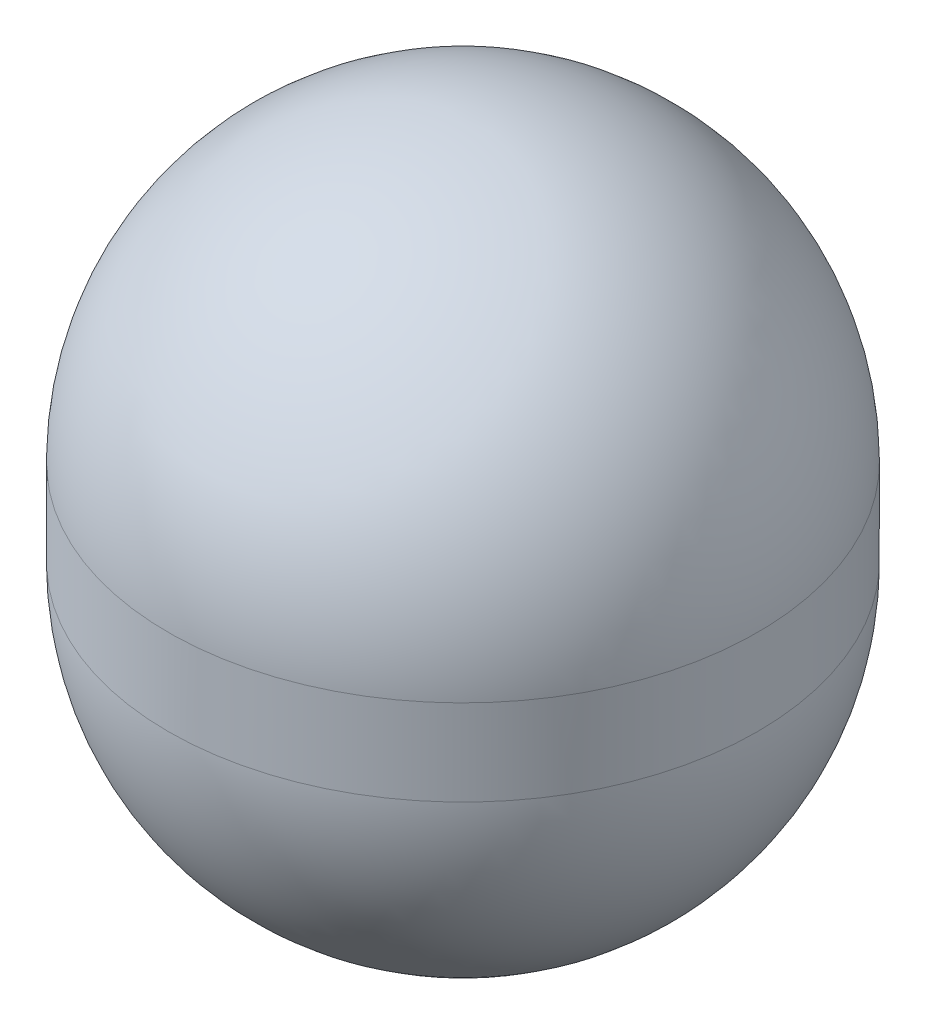
ISO-10303-21;
HEADER;
FILE_DESCRIPTION(('STEP AP214'),'2;1');
FILE_NAME('part.step','',(''),(''),'','','');
FILE_SCHEMA(('AUTOMOTIVE_DESIGN { 1 0 10303 214 1 1 1 1 }'));
ENDSEC;
DATA;
#1=APPLICATION_CONTEXT('core data for automotive mechanical design processes');
#2=APPLICATION_PROTOCOL_DEFINITION('international standard','automotive_design',2000,#1);
#3=PRODUCT_CONTEXT('',#1,'mechanical');
#4=PRODUCT('Part','Part','',(#3));
#5=PRODUCT_RELATED_PRODUCT_CATEGORY('part','',(#4));
#6=PRODUCT_DEFINITION_FORMATION('','',#4);
#7=PRODUCT_DEFINITION_CONTEXT('part definition',#1,'design');
#8=PRODUCT_DEFINITION('design','',#6,#7);
#9=PRODUCT_DEFINITION_SHAPE('','',#8);
#10=(LENGTH_UNIT() NAMED_UNIT(*) SI_UNIT(.MILLI.,.METRE.));
#11=(NAMED_UNIT(*) PLANE_ANGLE_UNIT() SI_UNIT($,.RADIAN.));
#12=(NAMED_UNIT(*) SI_UNIT($,.STERADIAN.) SOLID_ANGLE_UNIT());
#13=UNCERTAINTY_MEASURE_WITH_UNIT(LENGTH_MEASURE(1.E-05),#10,'distance_accuracy_value','');
#14=(GEOMETRIC_REPRESENTATION_CONTEXT(3) GLOBAL_UNCERTAINTY_ASSIGNED_CONTEXT((#13)) GLOBAL_UNIT_ASSIGNED_CONTEXT((#10,
#11,#12)) REPRESENTATION_CONTEXT('',''));
#15=CARTESIAN_POINT('',(0.,0.,0.));
#16=DIRECTION('',(0.,0.,1.));
#17=DIRECTION('',(1.,0.,0.));
#18=AXIS2_PLACEMENT_3D('',#15,#16,#17);
#19=CARTESIAN_POINT('',(0.,0.0350000000000001,0.));
#20=DIRECTION('',(0.,1.,0.));
#21=DIRECTION('',(-1.,0.,0.));
#22=AXIS2_PLACEMENT_3D('',#19,#20,#21);
#23=SPHERICAL_SURFACE('',#22,0.24);
#24=CARTESIAN_POINT('',(0.,0.0350000000000001,0.));
#25=DIRECTION('',(0.,1.,0.));
#26=DIRECTION('',(-1.,0.,0.));
#27=AXIS2_PLACEMENT_3D('',#24,#25,#26);
#28=CIRCLE('',#27,0.24);
#29=CARTESIAN_POINT('',(-0.24,0.0350000000000001,0.));
#30=VERTEX_POINT('',#29);
#31=EDGE_CURVE('E10',#30,#30,#28,.T.);
#32=ORIENTED_EDGE('',*,*,#31,.T.);
#33=EDGE_LOOP('',(#32));
#34=FACE_BOUND('',#33,.T.);
#35=ADVANCED_FACE('F31',(#34),#23,.T.);
#36=CARTESIAN_POINT('',(0.,0.,0.));
#37=DIRECTION('',(0.,1.,0.));
#38=DIRECTION('',(-1.,0.,0.));
#39=AXIS2_PLACEMENT_3D('',#36,#37,#38);
#40=CYLINDRICAL_SURFACE('',#39,0.24);
#41=CARTESIAN_POINT('',(0.,-0.035,0.));
#42=DIRECTION('',(0.,1.,0.));
#43=DIRECTION('',(-1.,0.,0.));
#44=AXIS2_PLACEMENT_3D('',#41,#42,#43);
#45=CIRCLE('',#44,0.24);
#46=CARTESIAN_POINT('',(-0.24,-0.0350000000000001,0.));
#47=VERTEX_POINT('',#46);
#48=EDGE_CURVE('E38',#47,#47,#45,.T.);
#49=ORIENTED_EDGE('',*,*,#48,.T.);
#50=EDGE_LOOP('',(#49));
#51=FACE_BOUND('',#50,.T.);
#52=ORIENTED_EDGE('',*,*,#31,.F.);
#53=EDGE_LOOP('',(#52));
#54=FACE_BOUND('',#53,.T.);
#55=ADVANCED_FACE('F33',(#51,#54),#40,.T.);
#56=CARTESIAN_POINT('',(0.,-0.0350000000000001,0.));
#57=DIRECTION('',(0.,1.,0.));
#58=DIRECTION('',(1.,0.,0.));
#59=AXIS2_PLACEMENT_3D('',#56,#57,#58);
#60=SPHERICAL_SURFACE('',#59,0.24);
#61=ORIENTED_EDGE('',*,*,#48,.F.);
#62=EDGE_LOOP('',(#61));
#63=FACE_BOUND('',#62,.T.);
#64=ADVANCED_FACE('F46',(#63),#60,.T.);
#65=CLOSED_SHELL('',(#35,#55,#64));
#66=MANIFOLD_SOLID_BREP('B2',#65);
#67=ADVANCED_BREP_SHAPE_REPRESENTATION('',(#18,#66),#14);
#68=SHAPE_DEFINITION_REPRESENTATION(#9,#67);
ENDSEC;
END-ISO-10303-21;
